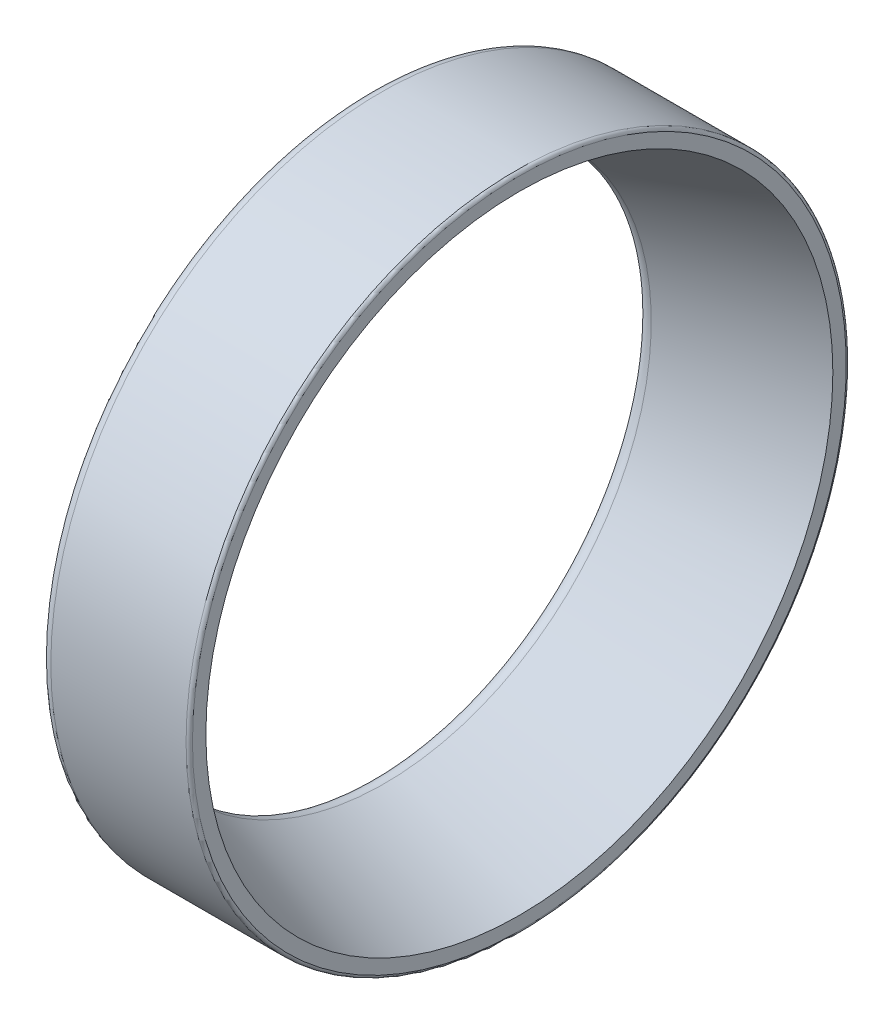
ISO-10303-21;
HEADER;
FILE_DESCRIPTION(('STEP AP214'),'2;1');
FILE_NAME('part.step','',(''),(''),'','','');
FILE_SCHEMA(('AUTOMOTIVE_DESIGN { 1 0 10303 214 1 1 1 1 }'));
ENDSEC;
DATA;
#1=APPLICATION_CONTEXT('core data for automotive mechanical design processes');
#2=APPLICATION_PROTOCOL_DEFINITION('international standard','automotive_design',2000,#1);
#3=PRODUCT_CONTEXT('',#1,'mechanical');
#4=PRODUCT('Part','Part','',(#3));
#5=PRODUCT_RELATED_PRODUCT_CATEGORY('part','',(#4));
#6=PRODUCT_DEFINITION_FORMATION('','',#4);
#7=PRODUCT_DEFINITION_CONTEXT('part definition',#1,'design');
#8=PRODUCT_DEFINITION('design','',#6,#7);
#9=PRODUCT_DEFINITION_SHAPE('','',#8);
#10=(LENGTH_UNIT() NAMED_UNIT(*) SI_UNIT(.MILLI.,.METRE.));
#11=(NAMED_UNIT(*) PLANE_ANGLE_UNIT() SI_UNIT($,.RADIAN.));
#12=(NAMED_UNIT(*) SI_UNIT($,.STERADIAN.) SOLID_ANGLE_UNIT());
#13=UNCERTAINTY_MEASURE_WITH_UNIT(LENGTH_MEASURE(1.E-05),#10,'distance_accuracy_value','');
#14=(GEOMETRIC_REPRESENTATION_CONTEXT(3) GLOBAL_UNCERTAINTY_ASSIGNED_CONTEXT((#13)) GLOBAL_UNIT_ASSIGNED_CONTEXT((#10,
#11,#12)) REPRESENTATION_CONTEXT('',''));
#15=CARTESIAN_POINT('',(0.,0.,0.));
#16=DIRECTION('',(0.,0.,1.));
#17=DIRECTION('',(1.,0.,0.));
#18=AXIS2_PLACEMENT_3D('',#15,#16,#17);
#19=CARTESIAN_POINT('',(0.3,0.,0.));
#20=DIRECTION('',(-1.,0.,0.));
#21=DIRECTION('',(0.,0.,1.));
#22=AXIS2_PLACEMENT_3D('',#19,#20,#21);
#23=TOROIDAL_SURFACE('',#22,26.0093629093503,1.);
#24=CARTESIAN_POINT('',(0.626377164466178,0.,0.));
#25=DIRECTION('',(-1.,0.,0.));
#26=DIRECTION('',(0.,0.,1.));
#27=AXIS2_PLACEMENT_3D('',#24,#25,#26);
#28=CIRCLE('',#27,25.0641232854903);
#29=CARTESIAN_POINT('',(0.626377164466178,0.,25.0641232854903));
#30=VERTEX_POINT('',#29);
#31=EDGE_CURVE('E10',#30,#30,#28,.T.);
#32=ORIENTED_EDGE('',*,*,#31,.F.);
#33=EDGE_LOOP('',(#32));
#34=FACE_BOUND('',#33,.T.);
#35=CARTESIAN_POINT('',(-0.7,0.,0.));
#36=DIRECTION('',(-1.,0.,0.));
#37=DIRECTION('',(0.,0.,1.));
#38=AXIS2_PLACEMENT_3D('',#35,#36,#37);
#39=CIRCLE('',#38,26.0093629093503);
#40=CARTESIAN_POINT('',(-0.7,0.,26.0093629093503));
#41=VERTEX_POINT('',#40);
#42=EDGE_CURVE('E40',#41,#41,#39,.T.);
#43=ORIENTED_EDGE('',*,*,#42,.T.);
#44=EDGE_LOOP('',(#43));
#45=FACE_BOUND('',#44,.T.);
#46=ADVANCED_FACE('F15',(#34,#45),#23,.T.);
#47=CARTESIAN_POINT('',(0.626377164466178,0.,0.));
#48=DIRECTION('',(1.,0.,0.));
#49=DIRECTION('',(0.,0.,-1.));
#50=AXIS2_PLACEMENT_3D('',#47,#48,#49);
#51=CONICAL_SURFACE('',#50,25.0641232854903,0.332468309777693);
#52=CARTESIAN_POINT('',(13.3,0.,0.));
#53=DIRECTION('',(-1.,0.,0.));
#54=DIRECTION('',(0.,0.,1.));
#55=AXIS2_PLACEMENT_3D('',#52,#53,#54);
#56=CIRCLE('',#55,29.4401364996675);
#57=CARTESIAN_POINT('',(13.3,0.,29.4401364996675));
#58=VERTEX_POINT('',#57);
#59=EDGE_CURVE('E21',#58,#58,#56,.T.);
#60=ORIENTED_EDGE('',*,*,#59,.F.);
#61=EDGE_LOOP('',(#60));
#62=FACE_BOUND('',#61,.T.);
#63=ORIENTED_EDGE('',*,*,#31,.T.);
#64=EDGE_LOOP('',(#63));
#65=FACE_BOUND('',#64,.T.);
#66=ADVANCED_FACE('F71',(#62,#65),#51,.F.);
#67=CARTESIAN_POINT('',(13.3,29.4401364996675,0.));
#68=DIRECTION('',(-1.,0.,0.));
#69=DIRECTION('',(0.,0.,1.));
#70=AXIS2_PLACEMENT_3D('',#67,#68,#69);
#71=PLANE('',#70);
#72=CARTESIAN_POINT('',(13.3,0.,0.));
#73=DIRECTION('',(-1.,0.,0.));
#74=DIRECTION('',(0.,0.,1.));
#75=AXIS2_PLACEMENT_3D('',#72,#73,#74);
#76=CIRCLE('',#75,30.7);
#77=CARTESIAN_POINT('',(13.3,0.,30.7));
#78=VERTEX_POINT('',#77);
#79=EDGE_CURVE('E25',#78,#78,#76,.T.);
#80=ORIENTED_EDGE('',*,*,#79,.F.);
#81=EDGE_LOOP('',(#80));
#82=FACE_BOUND('',#81,.T.);
#83=ORIENTED_EDGE('',*,*,#59,.T.);
#84=EDGE_LOOP('',(#83));
#85=FACE_BOUND('',#84,.T.);
#86=ADVANCED_FACE('F66',(#82,#85),#71,.F.);
#87=CARTESIAN_POINT('',(13.,0.,0.));
#88=DIRECTION('',(-1.,0.,0.));
#89=DIRECTION('',(0.,0.,1.));
#90=AXIS2_PLACEMENT_3D('',#87,#88,#89);
#91=TOROIDAL_SURFACE('',#90,30.7,0.3);
#92=CARTESIAN_POINT('',(13.,0.,0.));
#93=DIRECTION('',(-1.,0.,0.));
#94=DIRECTION('',(0.,0.,1.));
#95=AXIS2_PLACEMENT_3D('',#92,#93,#94);
#96=CIRCLE('',#95,31.);
#97=CARTESIAN_POINT('',(13.,0.,31.));
#98=VERTEX_POINT('',#97);
#99=EDGE_CURVE('E29',#98,#98,#96,.T.);
#100=ORIENTED_EDGE('',*,*,#99,.F.);
#101=EDGE_LOOP('',(#100));
#102=FACE_BOUND('',#101,.T.);
#103=ORIENTED_EDGE('',*,*,#79,.T.);
#104=EDGE_LOOP('',(#103));
#105=FACE_BOUND('',#104,.T.);
#106=ADVANCED_FACE('F60',(#102,#105),#91,.T.);
#107=CARTESIAN_POINT('',(0.,0.,0.));
#108=DIRECTION('',(-1.,0.,0.));
#109=DIRECTION('',(0.,0.,1.));
#110=AXIS2_PLACEMENT_3D('',#107,#108,#109);
#111=CYLINDRICAL_SURFACE('',#110,31.);
#112=CARTESIAN_POINT('',(0.3,0.,0.));
#113=DIRECTION('',(-1.,0.,0.));
#114=DIRECTION('',(0.,0.,1.));
#115=AXIS2_PLACEMENT_3D('',#112,#113,#114);
#116=CIRCLE('',#115,31.);
#117=CARTESIAN_POINT('',(0.3,0.,31.));
#118=VERTEX_POINT('',#117);
#119=EDGE_CURVE('E34',#118,#118,#116,.T.);
#120=ORIENTED_EDGE('',*,*,#119,.F.);
#121=EDGE_LOOP('',(#120));
#122=FACE_BOUND('',#121,.T.);
#123=ORIENTED_EDGE('',*,*,#99,.T.);
#124=EDGE_LOOP('',(#123));
#125=FACE_BOUND('',#124,.T.);
#126=ADVANCED_FACE('F54',(#122,#125),#111,.T.);
#127=CARTESIAN_POINT('',(0.3,0.,0.));
#128=DIRECTION('',(-1.,0.,0.));
#129=DIRECTION('',(0.,0.,1.));
#130=AXIS2_PLACEMENT_3D('',#127,#128,#129);
#131=TOROIDAL_SURFACE('',#130,30.,1.);
#132=CARTESIAN_POINT('',(-0.7,0.,0.));
#133=DIRECTION('',(-1.,0.,0.));
#134=DIRECTION('',(0.,0.,1.));
#135=AXIS2_PLACEMENT_3D('',#132,#133,#134);
#136=CIRCLE('',#135,30.);
#137=CARTESIAN_POINT('',(-0.7,0.,30.));
#138=VERTEX_POINT('',#137);
#139=EDGE_CURVE('E37',#138,#138,#136,.T.);
#140=ORIENTED_EDGE('',*,*,#139,.F.);
#141=EDGE_LOOP('',(#140));
#142=FACE_BOUND('',#141,.T.);
#143=ORIENTED_EDGE('',*,*,#119,.T.);
#144=EDGE_LOOP('',(#143));
#145=FACE_BOUND('',#144,.T.);
#146=ADVANCED_FACE('F48',(#142,#145),#131,.T.);
#147=CARTESIAN_POINT('',(-0.7,30.,0.));
#148=DIRECTION('',(1.,0.,0.));
#149=DIRECTION('',(0.,0.,-1.));
#150=AXIS2_PLACEMENT_3D('',#147,#148,#149);
#151=PLANE('',#150);
#152=ORIENTED_EDGE('',*,*,#42,.F.);
#153=EDGE_LOOP('',(#152));
#154=FACE_BOUND('',#153,.T.);
#155=ORIENTED_EDGE('',*,*,#139,.T.);
#156=EDGE_LOOP('',(#155));
#157=FACE_BOUND('',#156,.T.);
#158=ADVANCED_FACE('F45',(#154,#157),#151,.F.);
#159=CLOSED_SHELL('',(#46,#66,#86,#106,#126,#146,#158));
#160=MANIFOLD_SOLID_BREP('B1',#159);
#161=ADVANCED_BREP_SHAPE_REPRESENTATION('',(#18,#160),#14);
#162=SHAPE_DEFINITION_REPRESENTATION(#9,#161);
ENDSEC;
END-ISO-10303-21;
